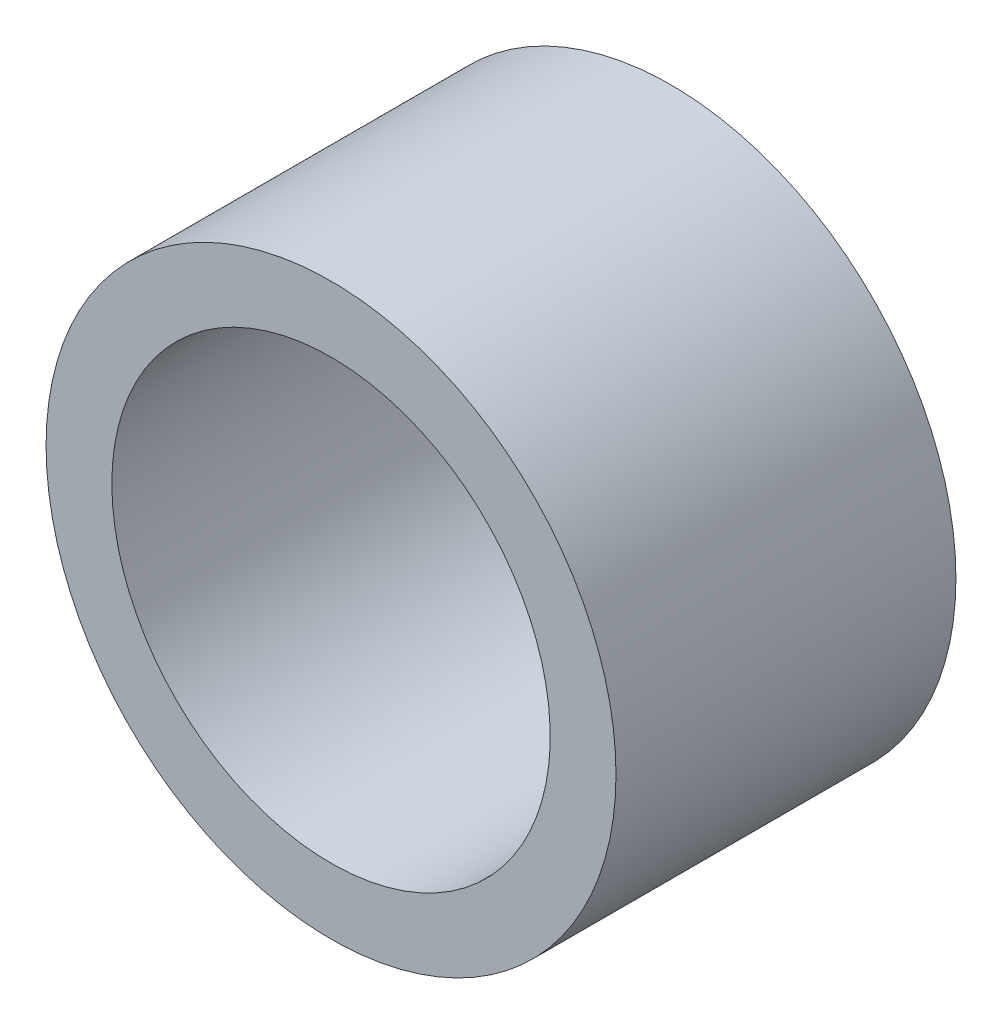
ISO-10303-21;
HEADER;
FILE_DESCRIPTION(('STEP AP214'),'2;1');
FILE_NAME('part.step','',(''),(''),'','','');
FILE_SCHEMA(('AUTOMOTIVE_DESIGN { 1 0 10303 214 1 1 1 1 }'));
ENDSEC;
DATA;
#1=APPLICATION_CONTEXT('core data for automotive mechanical design processes');
#2=APPLICATION_PROTOCOL_DEFINITION('international standard','automotive_design',2000,#1);
#3=PRODUCT_CONTEXT('',#1,'mechanical');
#4=PRODUCT('Part','Part','',(#3));
#5=PRODUCT_RELATED_PRODUCT_CATEGORY('part','',(#4));
#6=PRODUCT_DEFINITION_FORMATION('','',#4);
#7=PRODUCT_DEFINITION_CONTEXT('part definition',#1,'design');
#8=PRODUCT_DEFINITION('design','',#6,#7);
#9=PRODUCT_DEFINITION_SHAPE('','',#8);
#10=(LENGTH_UNIT() NAMED_UNIT(*) SI_UNIT(.MILLI.,.METRE.));
#11=(NAMED_UNIT(*) PLANE_ANGLE_UNIT() SI_UNIT($,.RADIAN.));
#12=(NAMED_UNIT(*) SI_UNIT($,.STERADIAN.) SOLID_ANGLE_UNIT());
#13=UNCERTAINTY_MEASURE_WITH_UNIT(LENGTH_MEASURE(1.E-05),#10,'distance_accuracy_value','');
#14=(GEOMETRIC_REPRESENTATION_CONTEXT(3) GLOBAL_UNCERTAINTY_ASSIGNED_CONTEXT((#13)) GLOBAL_UNIT_ASSIGNED_CONTEXT((#10,
#11,#12)) REPRESENTATION_CONTEXT('',''));
#15=CARTESIAN_POINT('',(0.,0.,0.));
#16=DIRECTION('',(0.,0.,1.));
#17=DIRECTION('',(1.,0.,0.));
#18=AXIS2_PLACEMENT_3D('',#15,#16,#17);
#19=CARTESIAN_POINT('',(0.,0.,0.));
#20=DIRECTION('',(0.,0.,-1.));
#21=DIRECTION('',(-1.,0.,0.));
#22=AXIS2_PLACEMENT_3D('',#19,#20,#21);
#23=CYLINDRICAL_SURFACE('',#22,63.5);
#24=CARTESIAN_POINT('',(0.,0.,98.4738461538462));
#25=DIRECTION('',(0.,0.,-1.));
#26=DIRECTION('',(-1.,0.,0.));
#27=AXIS2_PLACEMENT_3D('',#24,#25,#26);
#28=CIRCLE('',#27,63.5);
#29=CARTESIAN_POINT('',(-63.5,0.,98.4738461538462));
#30=VERTEX_POINT('',#29);
#31=EDGE_CURVE('E53',#30,#30,#28,.T.);
#32=ORIENTED_EDGE('',*,*,#31,.F.);
#33=EDGE_LOOP('',(#32));
#34=FACE_BOUND('',#33,.T.);
#35=CARTESIAN_POINT('',(0.,0.,0.));
#36=DIRECTION('',(0.,0.,-1.));
#37=DIRECTION('',(-1.,0.,0.));
#38=AXIS2_PLACEMENT_3D('',#35,#36,#37);
#39=CIRCLE('',#38,63.5);
#40=CARTESIAN_POINT('',(-63.5,0.,0.));
#41=VERTEX_POINT('',#40);
#42=EDGE_CURVE('E10',#41,#41,#39,.T.);
#43=ORIENTED_EDGE('',*,*,#42,.T.);
#44=EDGE_LOOP('',(#43));
#45=FACE_BOUND('',#44,.T.);
#46=ADVANCED_FACE('F39',(#34,#45),#23,.F.);
#47=CARTESIAN_POINT('',(0.,-63.5,0.));
#48=DIRECTION('',(0.,0.,1.));
#49=DIRECTION('',(1.,0.,0.));
#50=AXIS2_PLACEMENT_3D('',#47,#48,#49);
#51=PLANE('',#50);
#52=ORIENTED_EDGE('',*,*,#42,.F.);
#53=EDGE_LOOP('',(#52));
#54=FACE_BOUND('',#53,.T.);
#55=CARTESIAN_POINT('',(0.,0.,0.));
#56=DIRECTION('',(0.,0.,-1.));
#57=DIRECTION('',(-1.,0.,0.));
#58=AXIS2_PLACEMENT_3D('',#55,#56,#57);
#59=CIRCLE('',#58,82.55);
#60=CARTESIAN_POINT('',(-82.55,0.,0.));
#61=VERTEX_POINT('',#60);
#62=EDGE_CURVE('E45',#61,#61,#59,.T.);
#63=ORIENTED_EDGE('',*,*,#62,.T.);
#64=EDGE_LOOP('',(#63));
#65=FACE_BOUND('',#64,.T.);
#66=ADVANCED_FACE('F62',(#54,#65),#51,.F.);
#67=CARTESIAN_POINT('',(0.,0.,0.));
#68=DIRECTION('',(0.,0.,-1.));
#69=DIRECTION('',(-1.,0.,0.));
#70=AXIS2_PLACEMENT_3D('',#67,#68,#69);
#71=CYLINDRICAL_SURFACE('',#70,82.55);
#72=ORIENTED_EDGE('',*,*,#62,.F.);
#73=EDGE_LOOP('',(#72));
#74=FACE_BOUND('',#73,.T.);
#75=CARTESIAN_POINT('',(0.,0.,98.4738461538462));
#76=DIRECTION('',(0.,0.,-1.));
#77=DIRECTION('',(-1.,0.,0.));
#78=AXIS2_PLACEMENT_3D('',#75,#76,#77);
#79=CIRCLE('',#78,82.55);
#80=CARTESIAN_POINT('',(-82.55,0.,98.4738461538462));
#81=VERTEX_POINT('',#80);
#82=EDGE_CURVE('E49',#81,#81,#79,.T.);
#83=ORIENTED_EDGE('',*,*,#82,.T.);
#84=EDGE_LOOP('',(#83));
#85=FACE_BOUND('',#84,.T.);
#86=ADVANCED_FACE('F66',(#74,#85),#71,.T.);
#87=CARTESIAN_POINT('',(0.,-82.55,98.4738461538462));
#88=DIRECTION('',(0.,0.,-1.));
#89=DIRECTION('',(-1.,0.,0.));
#90=AXIS2_PLACEMENT_3D('',#87,#88,#89);
#91=PLANE('',#90);
#92=ORIENTED_EDGE('',*,*,#82,.F.);
#93=EDGE_LOOP('',(#92));
#94=FACE_BOUND('',#93,.T.);
#95=ORIENTED_EDGE('',*,*,#31,.T.);
#96=EDGE_LOOP('',(#95));
#97=FACE_BOUND('',#96,.T.);
#98=ADVANCED_FACE('F59',(#94,#97),#91,.F.);
#99=CLOSED_SHELL('',(#46,#66,#86,#98));
#100=MANIFOLD_SOLID_BREP('B2',#99);
#101=ADVANCED_BREP_SHAPE_REPRESENTATION('',(#18,#100),#14);
#102=SHAPE_DEFINITION_REPRESENTATION(#9,#101);
ENDSEC;
END-ISO-10303-21;
